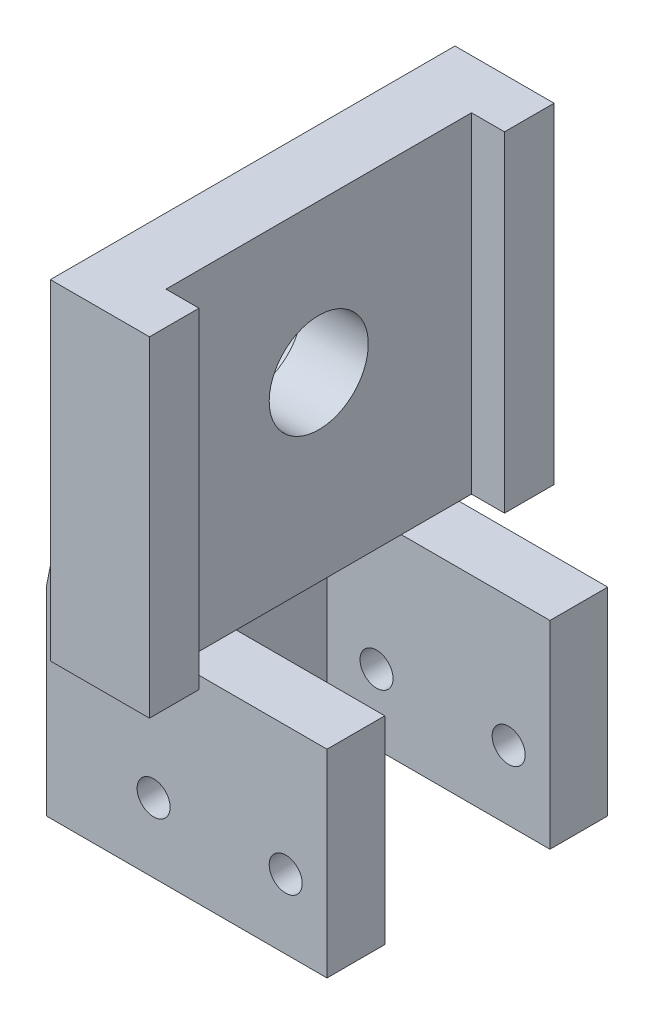
ISO-10303-21;
HEADER;
FILE_DESCRIPTION(('STEP AP214'),'2;1');
FILE_NAME('part.step','',(''),(''),'','','');
FILE_SCHEMA(('AUTOMOTIVE_DESIGN { 1 0 10303 214 1 1 1 1 }'));
ENDSEC;
DATA;
#1=APPLICATION_CONTEXT('core data for automotive mechanical design processes');
#2=APPLICATION_PROTOCOL_DEFINITION('international standard','automotive_design',2000,#1);
#3=PRODUCT_CONTEXT('',#1,'mechanical');
#4=PRODUCT('Part','Part','',(#3));
#5=PRODUCT_RELATED_PRODUCT_CATEGORY('part','',(#4));
#6=PRODUCT_DEFINITION_FORMATION('','',#4);
#7=PRODUCT_DEFINITION_CONTEXT('part definition',#1,'design');
#8=PRODUCT_DEFINITION('design','',#6,#7);
#9=PRODUCT_DEFINITION_SHAPE('','',#8);
#10=(LENGTH_UNIT() NAMED_UNIT(*) SI_UNIT(.MILLI.,.METRE.));
#11=(NAMED_UNIT(*) PLANE_ANGLE_UNIT() SI_UNIT($,.RADIAN.));
#12=(NAMED_UNIT(*) SI_UNIT($,.STERADIAN.) SOLID_ANGLE_UNIT());
#13=UNCERTAINTY_MEASURE_WITH_UNIT(LENGTH_MEASURE(1.E-05),#10,'distance_accuracy_value','');
#14=(GEOMETRIC_REPRESENTATION_CONTEXT(3) GLOBAL_UNCERTAINTY_ASSIGNED_CONTEXT((#13)) GLOBAL_UNIT_ASSIGNED_CONTEXT((#10,
#11,#12)) REPRESENTATION_CONTEXT('',''));
#15=CARTESIAN_POINT('',(0.,0.,0.));
#16=DIRECTION('',(0.,0.,1.));
#17=DIRECTION('',(1.,0.,0.));
#18=AXIS2_PLACEMENT_3D('',#15,#16,#17);
#19=CARTESIAN_POINT('',(-16.5196941383112,-12.,0.0898514208462865));
#20=DIRECTION('',(0.,0.,-1.));
#21=DIRECTION('',(-1.,0.,0.));
#22=AXIS2_PLACEMENT_3D('',#19,#20,#21);
#23=PLANE('',#22);
#24=CARTESIAN_POINT('',(-27.0196941383112,-7.8,0.0898514208462851));
#25=DIRECTION('',(0.,0.,-1.));
#26=DIRECTION('',(-1.,0.,0.));
#27=AXIS2_PLACEMENT_3D('',#24,#25,#26);
#28=CIRCLE('',#27,1.);
#29=CARTESIAN_POINT('',(-28.0196941383112,-7.8,0.0898514208462849));
#30=VERTEX_POINT('',#29);
#31=EDGE_CURVE('E234',#30,#30,#28,.T.);
#32=ORIENTED_EDGE('',*,*,#31,.T.);
#33=EDGE_LOOP('',(#32));
#34=FACE_BOUND('',#33,.T.);
#35=CARTESIAN_POINT('',(-19.0196941383112,-7.8,0.0898514208462868));
#36=DIRECTION('',(0.,0.,-1.));
#37=DIRECTION('',(-1.,0.,0.));
#38=AXIS2_PLACEMENT_3D('',#35,#36,#37);
#39=CIRCLE('',#38,1.);
#40=CARTESIAN_POINT('',(-20.0196941383112,-7.8,0.0898514208462867));
#41=VERTEX_POINT('',#40);
#42=EDGE_CURVE('E240',#41,#41,#39,.T.);
#43=ORIENTED_EDGE('',*,*,#42,.T.);
#44=EDGE_LOOP('',(#43));
#45=FACE_BOUND('',#44,.T.);
#46=DIRECTION('',(-0.776863811983067,-0.629668657018227,0.));
#47=VECTOR('',#46,1.);
#48=CARTESIAN_POINT('',(-25.5196941383112,0.,0.0898514208462781));
#49=LINE('',#48,#47);
#50=CARTESIAN_POINT('',(-25.5196941383112,0.,0.0898514208462851));
#51=VERTEX_POINT('',#50);
#52=CARTESIAN_POINT('',(-30.0196941383112,-3.64736896335671,0.0898514208462848));
#53=VERTEX_POINT('',#52);
#54=EDGE_CURVE('E55',#51,#53,#49,.T.);
#55=ORIENTED_EDGE('',*,*,#54,.T.);
#56=DIRECTION('',(0.,1.,0.));
#57=VECTOR('',#56,1.);
#58=CARTESIAN_POINT('',(-30.0196941383112,-12.,0.0898514208462848));
#59=LINE('',#58,#57);
#60=CARTESIAN_POINT('',(-30.0196941383112,-12.,0.0898514208462848));
#61=VERTEX_POINT('',#60);
#62=EDGE_CURVE('E190',#61,#53,#59,.T.);
#63=ORIENTED_EDGE('',*,*,#62,.F.);
#64=DIRECTION('',(-1.,0.,0.));
#65=VECTOR('',#64,1.);
#66=CARTESIAN_POINT('',(-16.5196941383112,-12.,0.0898514208462865));
#67=LINE('',#66,#65);
#68=CARTESIAN_POINT('',(-16.5196941383112,-12.,0.0898514208462865));
#69=VERTEX_POINT('',#68);
#70=EDGE_CURVE('E247',#69,#61,#67,.T.);
#71=ORIENTED_EDGE('',*,*,#70,.F.);
#72=DIRECTION('',(0.,1.,0.));
#73=VECTOR('',#72,1.);
#74=CARTESIAN_POINT('',(-16.5196941383112,-12.,0.0898514208462865));
#75=LINE('',#74,#73);
#76=CARTESIAN_POINT('',(-16.5196941383112,0.,0.0898514208462865));
#77=VERTEX_POINT('',#76);
#78=EDGE_CURVE('E289',#69,#77,#75,.T.);
#79=ORIENTED_EDGE('',*,*,#78,.T.);
#80=DIRECTION('',(-1.,0.,0.));
#81=VECTOR('',#80,1.);
#82=CARTESIAN_POINT('',(-16.5196941383112,0.,0.0898514208462865));
#83=LINE('',#82,#81);
#84=EDGE_CURVE('E263',#77,#51,#83,.T.);
#85=ORIENTED_EDGE('',*,*,#84,.T.);
#86=EDGE_LOOP('',(#55,#63,#71,#79,#85));
#87=FACE_BOUND('',#86,.T.);
#88=ADVANCED_FACE('F37',(#34,#45,#87),#23,.F.);
#89=CARTESIAN_POINT('',(-30.0196941383112,-12.,0.0898514208462848));
#90=DIRECTION('',(-1.,0.,0.));
#91=DIRECTION('',(0.,0.,1.));
#92=AXIS2_PLACEMENT_3D('',#89,#90,#91);
#93=PLANE('',#92);
#94=DIRECTION('',(0.,0.,1.));
#95=VECTOR('',#94,1.);
#96=CARTESIAN_POINT('',(-30.0196941383112,-3.64736896335671,0.0898514208462781));
#97=LINE('',#96,#95);
#98=CARTESIAN_POINT('',(-30.0196941383112,-3.64736896335671,10.0898514208463));
#99=VERTEX_POINT('',#98);
#100=EDGE_CURVE('E194',#53,#99,#97,.T.);
#101=ORIENTED_EDGE('',*,*,#100,.T.);
#102=DIRECTION('',(0.,1.,0.));
#103=VECTOR('',#102,1.);
#104=CARTESIAN_POINT('',(-30.0196941383112,-12.,10.0898514208463));
#105=LINE('',#104,#103);
#106=CARTESIAN_POINT('',(-30.0196941383112,-12.,10.0898514208463));
#107=VERTEX_POINT('',#106);
#108=EDGE_CURVE('E180',#107,#99,#105,.T.);
#109=ORIENTED_EDGE('',*,*,#108,.F.);
#110=DIRECTION('',(0.,0.,1.));
#111=VECTOR('',#110,1.);
#112=CARTESIAN_POINT('',(-30.0196941383112,-12.,0.0898514208462848));
#113=LINE('',#112,#111);
#114=EDGE_CURVE('E249',#61,#107,#113,.T.);
#115=ORIENTED_EDGE('',*,*,#114,.F.);
#116=ORIENTED_EDGE('',*,*,#62,.T.);
#117=EDGE_LOOP('',(#101,#109,#115,#116));
#118=FACE_BOUND('',#117,.T.);
#119=ADVANCED_FACE('F195',(#118),#93,.F.);
#120=CARTESIAN_POINT('',(-30.0196941383112,-12.,10.0898514208463));
#121=DIRECTION('',(0.,0.,1.));
#122=DIRECTION('',(1.,0.,0.));
#123=AXIS2_PLACEMENT_3D('',#120,#121,#122);
#124=PLANE('',#123);
#125=CARTESIAN_POINT('',(-27.0196941383112,-7.8,10.0898514208463));
#126=DIRECTION('',(0.,0.,1.));
#127=DIRECTION('',(1.,0.,0.));
#128=AXIS2_PLACEMENT_3D('',#125,#126,#127);
#129=CIRCLE('',#128,1.);
#130=CARTESIAN_POINT('',(-26.0196941383112,-7.8,10.0898514208463));
#131=VERTEX_POINT('',#130);
#132=EDGE_CURVE('E223',#131,#131,#129,.T.);
#133=ORIENTED_EDGE('',*,*,#132,.T.);
#134=EDGE_LOOP('',(#133));
#135=FACE_BOUND('',#134,.T.);
#136=CARTESIAN_POINT('',(-19.0196941383112,-7.8,10.0898514208463));
#137=DIRECTION('',(0.,0.,1.));
#138=DIRECTION('',(1.,0.,0.));
#139=AXIS2_PLACEMENT_3D('',#136,#137,#138);
#140=CIRCLE('',#139,1.);
#141=CARTESIAN_POINT('',(-18.0196941383112,-7.8,10.0898514208463));
#142=VERTEX_POINT('',#141);
#143=EDGE_CURVE('E237',#142,#142,#140,.T.);
#144=ORIENTED_EDGE('',*,*,#143,.T.);
#145=EDGE_LOOP('',(#144));
#146=FACE_BOUND('',#145,.T.);
#147=DIRECTION('',(-0.776863811983067,-0.629668657018227,0.));
#148=VECTOR('',#147,1.);
#149=CARTESIAN_POINT('',(-25.5196941383112,0.,10.0898514208463));
#150=LINE('',#149,#148);
#151=CARTESIAN_POINT('',(-25.5196941383112,0.,10.0898514208463));
#152=VERTEX_POINT('',#151);
#153=EDGE_CURVE('E184',#152,#99,#150,.T.);
#154=ORIENTED_EDGE('',*,*,#153,.F.);
#155=DIRECTION('',(1.,0.,0.));
#156=VECTOR('',#155,1.);
#157=CARTESIAN_POINT('',(-30.0196941383112,0.,10.0898514208463));
#158=LINE('',#157,#156);
#159=CARTESIAN_POINT('',(-16.5196941383112,0.,10.0898514208463));
#160=VERTEX_POINT('',#159);
#161=EDGE_CURVE('E265',#152,#160,#158,.T.);
#162=ORIENTED_EDGE('',*,*,#161,.T.);
#163=DIRECTION('',(0.,1.,0.));
#164=VECTOR('',#163,1.);
#165=CARTESIAN_POINT('',(-16.5196941383112,-12.,10.0898514208463));
#166=LINE('',#165,#164);
#167=CARTESIAN_POINT('',(-16.5196941383112,-12.,10.0898514208463));
#168=VERTEX_POINT('',#167);
#169=EDGE_CURVE('E191',#168,#160,#166,.T.);
#170=ORIENTED_EDGE('',*,*,#169,.F.);
#171=DIRECTION('',(1.,0.,0.));
#172=VECTOR('',#171,1.);
#173=CARTESIAN_POINT('',(-30.0196941383112,-12.,10.0898514208463));
#174=LINE('',#173,#172);
#175=EDGE_CURVE('E187',#107,#168,#174,.T.);
#176=ORIENTED_EDGE('',*,*,#175,.F.);
#177=ORIENTED_EDGE('',*,*,#108,.T.);
#178=EDGE_LOOP('',(#154,#162,#170,#176,#177));
#179=FACE_BOUND('',#178,.T.);
#180=ADVANCED_FACE('F182',(#135,#146,#179),#124,.F.);
#181=CARTESIAN_POINT('',(0.,0.,0.));
#182=DIRECTION('',(0.,1.,0.));
#183=DIRECTION('',(0.,0.,1.));
#184=AXIS2_PLACEMENT_3D('',#181,#182,#183);
#185=PLANE('',#184);
#186=DIRECTION('',(1.,0.,0.));
#187=VECTOR('',#186,1.);
#188=CARTESIAN_POINT('',(-16.5196941383112,0.,-3.41014857915371));
#189=LINE('',#188,#187);
#190=CARTESIAN_POINT('',(-29.5196941383112,0.,-3.41014857915372));
#191=VERTEX_POINT('',#190);
#192=CARTESIAN_POINT('',(-25.5196941383112,0.,-3.41014857915372));
#193=VERTEX_POINT('',#192);
#194=EDGE_CURVE('E11',#191,#193,#189,.T.);
#195=ORIENTED_EDGE('',*,*,#194,.F.);
#196=DIRECTION('',(0.,0.,1.));
#197=VECTOR('',#196,1.);
#198=CARTESIAN_POINT('',(-29.5196941383112,0.,-7.16014857915371));
#199=LINE('',#198,#197);
#200=CARTESIAN_POINT('',(-29.5196941383112,0.,-7.16014857915371));
#201=VERTEX_POINT('',#200);
#202=EDGE_CURVE('E318',#201,#191,#199,.T.);
#203=ORIENTED_EDGE('',*,*,#202,.F.);
#204=DIRECTION('',(-1.,0.,0.));
#205=VECTOR('',#204,1.);
#206=CARTESIAN_POINT('',(-23.5196941383112,0.,-7.16014857915371));
#207=LINE('',#206,#205);
#208=CARTESIAN_POINT('',(-23.5196941383112,0.,-7.16014857915371));
#209=VERTEX_POINT('',#208);
#210=EDGE_CURVE('E295',#209,#201,#207,.T.);
#211=ORIENTED_EDGE('',*,*,#210,.F.);
#212=DIRECTION('',(0.,0.,-1.));
#213=VECTOR('',#212,1.);
#214=CARTESIAN_POINT('',(-23.5196941383112,0.,-4.16014857915371));
#215=LINE('',#214,#213);
#216=CARTESIAN_POINT('',(-23.5196941383112,0.,-4.16014857915371));
#217=VERTEX_POINT('',#216);
#218=EDGE_CURVE('E300',#217,#209,#215,.T.);
#219=ORIENTED_EDGE('',*,*,#218,.F.);
#220=DIRECTION('',(1.,0.,0.));
#221=VECTOR('',#220,1.);
#222=CARTESIAN_POINT('',(-25.5196941383112,0.,-4.16014857915371));
#223=LINE('',#222,#221);
#224=CARTESIAN_POINT('',(-25.5196941383112,0.,-4.16014857915371));
#225=VERTEX_POINT('',#224);
#226=EDGE_CURVE('E331',#225,#217,#223,.T.);
#227=ORIENTED_EDGE('',*,*,#226,.F.);
#228=DIRECTION('',(0.,0.,-1.));
#229=VECTOR('',#228,1.);
#230=CARTESIAN_POINT('',(-25.5196941383112,0.,14.3398514208463));
#231=LINE('',#230,#229);
#232=EDGE_CURVE('E327',#193,#225,#231,.T.);
#233=ORIENTED_EDGE('',*,*,#232,.F.);
#234=EDGE_LOOP('',(#195,#203,#211,#219,#227,#233));
#235=FACE_BOUND('',#234,.T.);
#236=ADVANCED_FACE('F392',(#235),#185,.F.);
#237=DIRECTION('',(-1.,0.,0.));
#238=VECTOR('',#237,1.);
#239=CARTESIAN_POINT('',(-16.5196941383112,0.,13.5898514208463));
#240=LINE('',#239,#238);
#241=CARTESIAN_POINT('',(-25.5196941383112,0.,13.5898514208463));
#242=VERTEX_POINT('',#241);
#243=CARTESIAN_POINT('',(-29.5196941383112,0.,13.5898514208463));
#244=VERTEX_POINT('',#243);
#245=EDGE_CURVE('E46',#242,#244,#240,.T.);
#246=ORIENTED_EDGE('',*,*,#245,.F.);
#247=CARTESIAN_POINT('',(-25.5196941383112,0.,14.3398514208463));
#248=VERTEX_POINT('',#247);
#249=EDGE_CURVE('E328',#248,#242,#231,.T.);
#250=ORIENTED_EDGE('',*,*,#249,.F.);
#251=DIRECTION('',(-1.,0.,0.));
#252=VECTOR('',#251,1.);
#253=CARTESIAN_POINT('',(-23.5196941383112,0.,14.3398514208463));
#254=LINE('',#253,#252);
#255=CARTESIAN_POINT('',(-23.5196941383112,0.,14.3398514208463));
#256=VERTEX_POINT('',#255);
#257=EDGE_CURVE('E325',#256,#248,#254,.T.);
#258=ORIENTED_EDGE('',*,*,#257,.F.);
#259=DIRECTION('',(0.,0.,-1.));
#260=VECTOR('',#259,1.);
#261=CARTESIAN_POINT('',(-23.5196941383112,0.,17.3398514208463));
#262=LINE('',#261,#260);
#263=CARTESIAN_POINT('',(-23.5196941383112,0.,17.3398514208463));
#264=VERTEX_POINT('',#263);
#265=EDGE_CURVE('E323',#264,#256,#262,.T.);
#266=ORIENTED_EDGE('',*,*,#265,.F.);
#267=DIRECTION('',(1.,0.,0.));
#268=VECTOR('',#267,1.);
#269=CARTESIAN_POINT('',(-29.5196941383112,0.,17.3398514208463));
#270=LINE('',#269,#268);
#271=CARTESIAN_POINT('',(-29.5196941383112,0.,17.3398514208463));
#272=VERTEX_POINT('',#271);
#273=EDGE_CURVE('E321',#272,#264,#270,.T.);
#274=ORIENTED_EDGE('',*,*,#273,.F.);
#275=EDGE_CURVE('E317',#244,#272,#199,.T.);
#276=ORIENTED_EDGE('',*,*,#275,.F.);
#277=EDGE_LOOP('',(#246,#250,#258,#266,#274,#276));
#278=FACE_BOUND('',#277,.T.);
#279=ADVANCED_FACE('F368',(#278),#185,.F.);
#280=CARTESIAN_POINT('',(-23.5196941383112,20.,-7.16014857915371));
#281=DIRECTION('',(0.,0.,1.));
#282=DIRECTION('',(1.,0.,0.));
#283=AXIS2_PLACEMENT_3D('',#280,#281,#282);
#284=PLANE('',#283);
#285=ORIENTED_EDGE('',*,*,#210,.T.);
#286=DIRECTION('',(0.,-1.,0.));
#287=VECTOR('',#286,1.);
#288=CARTESIAN_POINT('',(-29.5196941383112,20.,-7.16014857915371));
#289=LINE('',#288,#287);
#290=CARTESIAN_POINT('',(-29.5196941383112,20.,-7.16014857915371));
#291=VERTEX_POINT('',#290);
#292=EDGE_CURVE('E354',#291,#201,#289,.T.);
#293=ORIENTED_EDGE('',*,*,#292,.F.);
#294=DIRECTION('',(-1.,0.,0.));
#295=VECTOR('',#294,1.);
#296=CARTESIAN_POINT('',(-23.5196941383112,20.,-7.16014857915371));
#297=LINE('',#296,#295);
#298=CARTESIAN_POINT('',(-23.5196941383112,20.,-7.16014857915371));
#299=VERTEX_POINT('',#298);
#300=EDGE_CURVE('E296',#299,#291,#297,.T.);
#301=ORIENTED_EDGE('',*,*,#300,.F.);
#302=DIRECTION('',(0.,-1.,0.));
#303=VECTOR('',#302,1.);
#304=CARTESIAN_POINT('',(-23.5196941383112,20.,-7.16014857915371));
#305=LINE('',#304,#303);
#306=EDGE_CURVE('E314',#299,#209,#305,.T.);
#307=ORIENTED_EDGE('',*,*,#306,.T.);
#308=EDGE_LOOP('',(#285,#293,#301,#307));
#309=FACE_BOUND('',#308,.T.);
#310=ADVANCED_FACE('F39',(#309),#284,.F.);
#311=CARTESIAN_POINT('',(-29.5196941383112,20.,-7.16014857915371));
#312=DIRECTION('',(1.,0.,0.));
#313=DIRECTION('',(0.,0.,-1.));
#314=AXIS2_PLACEMENT_3D('',#311,#312,#313);
#315=PLANE('',#314);
#316=DIRECTION('',(0.,0.,-1.));
#317=VECTOR('',#316,1.);
#318=CARTESIAN_POINT('',(-29.5196941383112,19.9572029758386,13.5898514208463));
#319=LINE('',#318,#317);
#320=CARTESIAN_POINT('',(-29.5196941383112,19.9572029758386,13.5898514208463));
#321=VERTEX_POINT('',#320);
#322=CARTESIAN_POINT('',(-29.5196941383112,19.9572029758386,-3.41014857915372));
#323=VERTEX_POINT('',#322);
#324=EDGE_CURVE('E211',#321,#323,#319,.T.);
#325=ORIENTED_EDGE('',*,*,#324,.F.);
#326=DIRECTION('',(0.,-1.,0.));
#327=VECTOR('',#326,1.);
#328=CARTESIAN_POINT('',(-29.5196941383112,19.9572029758386,13.5898514208463));
#329=LINE('',#328,#327);
#330=EDGE_CURVE('E209',#321,#244,#329,.T.);
#331=ORIENTED_EDGE('',*,*,#330,.T.);
#332=ORIENTED_EDGE('',*,*,#275,.T.);
#333=DIRECTION('',(0.,-1.,0.));
#334=VECTOR('',#333,1.);
#335=CARTESIAN_POINT('',(-29.5196941383112,20.,17.3398514208463));
#336=LINE('',#335,#334);
#337=CARTESIAN_POINT('',(-29.5196941383112,20.,17.3398514208463));
#338=VERTEX_POINT('',#337);
#339=EDGE_CURVE('E352',#338,#272,#336,.T.);
#340=ORIENTED_EDGE('',*,*,#339,.F.);
#341=DIRECTION('',(0.,0.,1.));
#342=VECTOR('',#341,1.);
#343=CARTESIAN_POINT('',(-29.5196941383112,20.,-7.16014857915371));
#344=LINE('',#343,#342);
#345=EDGE_CURVE('E299',#291,#338,#344,.T.);
#346=ORIENTED_EDGE('',*,*,#345,.F.);
#347=ORIENTED_EDGE('',*,*,#292,.T.);
#348=ORIENTED_EDGE('',*,*,#202,.T.);
#349=DIRECTION('',(0.,-1.,0.));
#350=VECTOR('',#349,1.);
#351=CARTESIAN_POINT('',(-29.5196941383112,19.9572029758386,-3.41014857915372));
#352=LINE('',#351,#350);
#353=EDGE_CURVE('E62',#323,#191,#352,.T.);
#354=ORIENTED_EDGE('',*,*,#353,.F.);
#355=EDGE_LOOP('',(#325,#331,#332,#340,#346,#347,#348,#354));
#356=FACE_BOUND('',#355,.T.);
#357=ADVANCED_FACE('F415',(#356),#315,.F.);
#358=CARTESIAN_POINT('',(-29.5196941383112,20.,17.3398514208463));
#359=DIRECTION('',(0.,0.,-1.));
#360=DIRECTION('',(-1.,0.,0.));
#361=AXIS2_PLACEMENT_3D('',#358,#359,#360);
#362=PLANE('',#361);
#363=ORIENTED_EDGE('',*,*,#273,.T.);
#364=DIRECTION('',(0.,-1.,0.));
#365=VECTOR('',#364,1.);
#366=CARTESIAN_POINT('',(-23.5196941383112,20.,17.3398514208463));
#367=LINE('',#366,#365);
#368=CARTESIAN_POINT('',(-23.5196941383112,20.,17.3398514208463));
#369=VERTEX_POINT('',#368);
#370=EDGE_CURVE('E349',#369,#264,#367,.T.);
#371=ORIENTED_EDGE('',*,*,#370,.F.);
#372=DIRECTION('',(1.,0.,0.));
#373=VECTOR('',#372,1.);
#374=CARTESIAN_POINT('',(-29.5196941383112,20.,17.3398514208463));
#375=LINE('',#374,#373);
#376=EDGE_CURVE('E302',#338,#369,#375,.T.);
#377=ORIENTED_EDGE('',*,*,#376,.F.);
#378=ORIENTED_EDGE('',*,*,#339,.T.);
#379=EDGE_LOOP('',(#363,#371,#377,#378));
#380=FACE_BOUND('',#379,.T.);
#381=ADVANCED_FACE('F414',(#380),#362,.F.);
#382=CARTESIAN_POINT('',(-23.5196941383112,20.,17.3398514208463));
#383=DIRECTION('',(-1.,0.,0.));
#384=DIRECTION('',(0.,0.,1.));
#385=AXIS2_PLACEMENT_3D('',#382,#383,#384);
#386=PLANE('',#385);
#387=ORIENTED_EDGE('',*,*,#265,.T.);
#388=DIRECTION('',(0.,-1.,0.));
#389=VECTOR('',#388,1.);
#390=CARTESIAN_POINT('',(-23.5196941383112,20.,14.3398514208463));
#391=LINE('',#390,#389);
#392=CARTESIAN_POINT('',(-23.5196941383112,20.,14.3398514208463));
#393=VERTEX_POINT('',#392);
#394=EDGE_CURVE('E346',#393,#256,#391,.T.);
#395=ORIENTED_EDGE('',*,*,#394,.F.);
#396=DIRECTION('',(0.,0.,-1.));
#397=VECTOR('',#396,1.);
#398=CARTESIAN_POINT('',(-23.5196941383112,20.,17.3398514208463));
#399=LINE('',#398,#397);
#400=EDGE_CURVE('E304',#369,#393,#399,.T.);
#401=ORIENTED_EDGE('',*,*,#400,.F.);
#402=ORIENTED_EDGE('',*,*,#370,.T.);
#403=EDGE_LOOP('',(#387,#395,#401,#402));
#404=FACE_BOUND('',#403,.T.);
#405=ADVANCED_FACE('F410',(#404),#386,.F.);
#406=CARTESIAN_POINT('',(-23.5196941383112,20.,14.3398514208463));
#407=DIRECTION('',(0.,0.,1.));
#408=DIRECTION('',(1.,0.,0.));
#409=AXIS2_PLACEMENT_3D('',#406,#407,#408);
#410=PLANE('',#409);
#411=ORIENTED_EDGE('',*,*,#257,.T.);
#412=DIRECTION('',(0.,-1.,0.));
#413=VECTOR('',#412,1.);
#414=CARTESIAN_POINT('',(-25.5196941383112,20.,14.3398514208463));
#415=LINE('',#414,#413);
#416=CARTESIAN_POINT('',(-25.5196941383112,20.,14.3398514208463));
#417=VERTEX_POINT('',#416);
#418=EDGE_CURVE('E343',#417,#248,#415,.T.);
#419=ORIENTED_EDGE('',*,*,#418,.F.);
#420=DIRECTION('',(-1.,0.,0.));
#421=VECTOR('',#420,1.);
#422=CARTESIAN_POINT('',(-23.5196941383112,20.,14.3398514208463));
#423=LINE('',#422,#421);
#424=EDGE_CURVE('E306',#393,#417,#423,.T.);
#425=ORIENTED_EDGE('',*,*,#424,.F.);
#426=ORIENTED_EDGE('',*,*,#394,.T.);
#427=EDGE_LOOP('',(#411,#419,#425,#426));
#428=FACE_BOUND('',#427,.T.);
#429=ADVANCED_FACE('F407',(#428),#410,.F.);
#430=CARTESIAN_POINT('',(-25.5196941383112,20.,14.3398514208463));
#431=DIRECTION('',(-1.,0.,0.));
#432=DIRECTION('',(0.,0.,1.));
#433=AXIS2_PLACEMENT_3D('',#430,#431,#432);
#434=PLANE('',#433);
#435=CARTESIAN_POINT('',(-25.5196941383112,11.,5.08985142084629));
#436=DIRECTION('',(-1.,0.,0.));
#437=DIRECTION('',(0.,0.,1.));
#438=AXIS2_PLACEMENT_3D('',#435,#436,#437);
#439=CIRCLE('',#438,3.);
#440=CARTESIAN_POINT('',(-25.5196941383112,11.,8.08985142084629));
#441=VERTEX_POINT('',#440);
#442=EDGE_CURVE('E292',#441,#441,#439,.T.);
#443=ORIENTED_EDGE('',*,*,#442,.T.);
#444=EDGE_LOOP('',(#443));
#445=FACE_BOUND('',#444,.T.);
#446=ORIENTED_EDGE('',*,*,#249,.T.);
#447=EDGE_CURVE('E332',#242,#152,#231,.T.);
#448=ORIENTED_EDGE('',*,*,#447,.T.);
#449=EDGE_CURVE('E201',#152,#51,#231,.T.);
#450=ORIENTED_EDGE('',*,*,#449,.T.);
#451=EDGE_CURVE('E380',#51,#193,#231,.T.);
#452=ORIENTED_EDGE('',*,*,#451,.T.);
#453=ORIENTED_EDGE('',*,*,#232,.T.);
#454=DIRECTION('',(0.,-1.,0.));
#455=VECTOR('',#454,1.);
#456=CARTESIAN_POINT('',(-25.5196941383112,20.,-4.16014857915371));
#457=LINE('',#456,#455);
#458=CARTESIAN_POINT('',(-25.5196941383112,20.,-4.16014857915371));
#459=VERTEX_POINT('',#458);
#460=EDGE_CURVE('E340',#459,#225,#457,.T.);
#461=ORIENTED_EDGE('',*,*,#460,.F.);
#462=DIRECTION('',(0.,0.,-1.));
#463=VECTOR('',#462,1.);
#464=CARTESIAN_POINT('',(-25.5196941383112,20.,14.3398514208463));
#465=LINE('',#464,#463);
#466=EDGE_CURVE('E308',#417,#459,#465,.T.);
#467=ORIENTED_EDGE('',*,*,#466,.F.);
#468=ORIENTED_EDGE('',*,*,#418,.T.);
#469=EDGE_LOOP('',(#446,#448,#450,#452,#453,#461,#467,#468));
#470=FACE_BOUND('',#469,.T.);
#471=ADVANCED_FACE('F373',(#445,#470),#434,.F.);
#472=CARTESIAN_POINT('',(-25.5196941383112,20.,-4.16014857915371));
#473=DIRECTION('',(0.,0.,-1.));
#474=DIRECTION('',(-1.,0.,0.));
#475=AXIS2_PLACEMENT_3D('',#472,#473,#474);
#476=PLANE('',#475);
#477=ORIENTED_EDGE('',*,*,#226,.T.);
#478=DIRECTION('',(0.,-1.,0.));
#479=VECTOR('',#478,1.);
#480=CARTESIAN_POINT('',(-23.5196941383112,20.,-4.16014857915371));
#481=LINE('',#480,#479);
#482=CARTESIAN_POINT('',(-23.5196941383112,20.,-4.16014857915371));
#483=VERTEX_POINT('',#482);
#484=EDGE_CURVE('E337',#483,#217,#481,.T.);
#485=ORIENTED_EDGE('',*,*,#484,.F.);
#486=DIRECTION('',(1.,0.,0.));
#487=VECTOR('',#486,1.);
#488=CARTESIAN_POINT('',(-25.5196941383112,20.,-4.16014857915371));
#489=LINE('',#488,#487);
#490=EDGE_CURVE('E310',#459,#483,#489,.T.);
#491=ORIENTED_EDGE('',*,*,#490,.F.);
#492=ORIENTED_EDGE('',*,*,#460,.T.);
#493=EDGE_LOOP('',(#477,#485,#491,#492));
#494=FACE_BOUND('',#493,.T.);
#495=ADVANCED_FACE('F389',(#494),#476,.F.);
#496=CARTESIAN_POINT('',(-23.5196941383112,20.,-4.16014857915371));
#497=DIRECTION('',(-1.,0.,0.));
#498=DIRECTION('',(0.,0.,1.));
#499=AXIS2_PLACEMENT_3D('',#496,#497,#498);
#500=PLANE('',#499);
#501=ORIENTED_EDGE('',*,*,#218,.T.);
#502=ORIENTED_EDGE('',*,*,#306,.F.);
#503=DIRECTION('',(0.,0.,-1.));
#504=VECTOR('',#503,1.);
#505=CARTESIAN_POINT('',(-23.5196941383112,20.,-4.16014857915371));
#506=LINE('',#505,#504);
#507=EDGE_CURVE('E312',#483,#299,#506,.T.);
#508=ORIENTED_EDGE('',*,*,#507,.F.);
#509=ORIENTED_EDGE('',*,*,#484,.T.);
#510=EDGE_LOOP('',(#501,#502,#508,#509));
#511=FACE_BOUND('',#510,.T.);
#512=ADVANCED_FACE('F396',(#511),#500,.F.);
#513=CARTESIAN_POINT('',(0.,20.,0.));
#514=DIRECTION('',(0.,1.,0.));
#515=DIRECTION('',(0.,0.,1.));
#516=AXIS2_PLACEMENT_3D('',#513,#514,#515);
#517=PLANE('',#516);
#518=ORIENTED_EDGE('',*,*,#300,.T.);
#519=ORIENTED_EDGE('',*,*,#345,.T.);
#520=ORIENTED_EDGE('',*,*,#376,.T.);
#521=ORIENTED_EDGE('',*,*,#400,.T.);
#522=ORIENTED_EDGE('',*,*,#424,.T.);
#523=ORIENTED_EDGE('',*,*,#466,.T.);
#524=ORIENTED_EDGE('',*,*,#490,.T.);
#525=ORIENTED_EDGE('',*,*,#507,.T.);
#526=EDGE_LOOP('',(#518,#519,#520,#521,#522,#523,#524,#525));
#527=FACE_BOUND('',#526,.T.);
#528=ADVANCED_FACE('F401',(#527),#517,.T.);
#529=CARTESIAN_POINT('',(-25.5196941383112,11.,5.08985142084629));
#530=DIRECTION('',(-1.,0.,0.));
#531=DIRECTION('',(0.,0.,1.));
#532=AXIS2_PLACEMENT_3D('',#529,#530,#531);
#533=CYLINDRICAL_SURFACE('',#532,3.);
#534=ORIENTED_EDGE('',*,*,#442,.F.);
#535=EDGE_LOOP('',(#534));
#536=FACE_BOUND('',#535,.T.);
#537=CARTESIAN_POINT('',(-29.5196941383112,11.,5.08985142084629));
#538=DIRECTION('',(1.,0.,0.));
#539=DIRECTION('',(0.,1.,0.));
#540=AXIS2_PLACEMENT_3D('',#537,#538,#539);
#541=CIRCLE('',#540,3.);
#542=CARTESIAN_POINT('',(-29.5196941383112,14.,5.08985142084629));
#543=VERTEX_POINT('',#542);
#544=EDGE_CURVE('E214',#543,#543,#541,.F.);
#545=ORIENTED_EDGE('',*,*,#544,.T.);
#546=EDGE_LOOP('',(#545));
#547=FACE_BOUND('',#546,.T.);
#548=ADVANCED_FACE('F454',(#536,#547),#533,.F.);
#549=CARTESIAN_POINT('',(0.,0.,0.));
#550=DIRECTION('',(0.,-1.,0.));
#551=DIRECTION('',(0.,0.,-1.));
#552=AXIS2_PLACEMENT_3D('',#549,#550,#551);
#553=PLANE('',#552);
#554=ORIENTED_EDGE('',*,*,#451,.F.);
#555=ORIENTED_EDGE('',*,*,#84,.F.);
#556=DIRECTION('',(0.,0.,1.));
#557=VECTOR('',#556,1.);
#558=CARTESIAN_POINT('',(-16.5196941383112,0.,-3.41014857915371));
#559=LINE('',#558,#557);
#560=CARTESIAN_POINT('',(-16.5196941383112,0.,-3.41014857915371));
#561=VERTEX_POINT('',#560);
#562=EDGE_CURVE('E243',#561,#77,#559,.T.);
#563=ORIENTED_EDGE('',*,*,#562,.F.);
#564=EDGE_CURVE('E48',#193,#561,#189,.T.);
#565=ORIENTED_EDGE('',*,*,#564,.F.);
#566=EDGE_LOOP('',(#554,#555,#563,#565));
#567=FACE_BOUND('',#566,.T.);
#568=ADVANCED_FACE('F457',(#567),#553,.F.);
#569=ORIENTED_EDGE('',*,*,#447,.F.);
#570=CARTESIAN_POINT('',(-16.5196941383112,0.,13.5898514208463));
#571=VERTEX_POINT('',#570);
#572=EDGE_CURVE('E269',#571,#242,#240,.T.);
#573=ORIENTED_EDGE('',*,*,#572,.F.);
#574=DIRECTION('',(0.,0.,1.));
#575=VECTOR('',#574,1.);
#576=CARTESIAN_POINT('',(-16.5196941383112,0.,10.0898514208463));
#577=LINE('',#576,#575);
#578=EDGE_CURVE('E267',#160,#571,#577,.T.);
#579=ORIENTED_EDGE('',*,*,#578,.F.);
#580=ORIENTED_EDGE('',*,*,#161,.F.);
#581=EDGE_LOOP('',(#569,#573,#579,#580));
#582=FACE_BOUND('',#581,.T.);
#583=ADVANCED_FACE('F378',(#582),#553,.F.);
#584=CARTESIAN_POINT('',(-16.5196941383112,-12.,-3.41014857915371));
#585=DIRECTION('',(-1.,0.,0.));
#586=DIRECTION('',(0.,0.,1.));
#587=AXIS2_PLACEMENT_3D('',#584,#585,#586);
#588=PLANE('',#587);
#589=ORIENTED_EDGE('',*,*,#562,.T.);
#590=ORIENTED_EDGE('',*,*,#78,.F.);
#591=DIRECTION('',(0.,0.,1.));
#592=VECTOR('',#591,1.);
#593=CARTESIAN_POINT('',(-16.5196941383112,-12.,-3.41014857915371));
#594=LINE('',#593,#592);
#595=CARTESIAN_POINT('',(-16.5196941383112,-12.,-3.41014857915371));
#596=VERTEX_POINT('',#595);
#597=EDGE_CURVE('E244',#596,#69,#594,.T.);
#598=ORIENTED_EDGE('',*,*,#597,.F.);
#599=DIRECTION('',(0.,1.,0.));
#600=VECTOR('',#599,1.);
#601=CARTESIAN_POINT('',(-16.5196941383112,-12.,-3.41014857915371));
#602=LINE('',#601,#600);
#603=EDGE_CURVE('E260',#596,#561,#602,.T.);
#604=ORIENTED_EDGE('',*,*,#603,.T.);
#605=EDGE_LOOP('',(#589,#590,#598,#604));
#606=FACE_BOUND('',#605,.T.);
#607=ADVANCED_FACE('F434',(#606),#588,.F.);
#608=CARTESIAN_POINT('',(-16.5196941383112,-12.,10.0898514208463));
#609=DIRECTION('',(-1.,0.,0.));
#610=DIRECTION('',(0.,0.,1.));
#611=AXIS2_PLACEMENT_3D('',#608,#609,#610);
#612=PLANE('',#611);
#613=ORIENTED_EDGE('',*,*,#578,.T.);
#614=DIRECTION('',(0.,1.,0.));
#615=VECTOR('',#614,1.);
#616=CARTESIAN_POINT('',(-16.5196941383112,-12.,13.5898514208463));
#617=LINE('',#616,#615);
#618=CARTESIAN_POINT('',(-16.5196941383112,-12.,13.5898514208463));
#619=VERTEX_POINT('',#618);
#620=EDGE_CURVE('E283',#619,#571,#617,.T.);
#621=ORIENTED_EDGE('',*,*,#620,.F.);
#622=DIRECTION('',(0.,0.,1.));
#623=VECTOR('',#622,1.);
#624=CARTESIAN_POINT('',(-16.5196941383112,-12.,10.0898514208463));
#625=LINE('',#624,#623);
#626=EDGE_CURVE('E252',#168,#619,#625,.T.);
#627=ORIENTED_EDGE('',*,*,#626,.F.);
#628=ORIENTED_EDGE('',*,*,#169,.T.);
#629=EDGE_LOOP('',(#613,#621,#627,#628));
#630=FACE_BOUND('',#629,.T.);
#631=ADVANCED_FACE('F432',(#630),#612,.F.);
#632=CARTESIAN_POINT('',(-16.5196941383112,-12.,13.5898514208463));
#633=DIRECTION('',(0.,0.,-1.));
#634=DIRECTION('',(-1.,0.,0.));
#635=AXIS2_PLACEMENT_3D('',#632,#633,#634);
#636=PLANE('',#635);
#637=CARTESIAN_POINT('',(-19.0196941383112,-7.8,13.5898514208463));
#638=DIRECTION('',(0.,0.,-1.));
#639=DIRECTION('',(-1.,0.,0.));
#640=AXIS2_PLACEMENT_3D('',#637,#638,#639);
#641=CIRCLE('',#640,1.);
#642=CARTESIAN_POINT('',(-20.0196941383112,-7.8,13.5898514208463));
#643=VERTEX_POINT('',#642);
#644=EDGE_CURVE('E220',#643,#643,#641,.T.);
#645=ORIENTED_EDGE('',*,*,#644,.T.);
#646=EDGE_LOOP('',(#645));
#647=FACE_BOUND('',#646,.T.);
#648=CARTESIAN_POINT('',(-27.0196941383112,-7.8,13.5898514208463));
#649=DIRECTION('',(0.,0.,-1.));
#650=DIRECTION('',(-1.,0.,0.));
#651=AXIS2_PLACEMENT_3D('',#648,#649,#650);
#652=CIRCLE('',#651,1.);
#653=CARTESIAN_POINT('',(-28.0196941383112,-7.8,13.5898514208463));
#654=VERTEX_POINT('',#653);
#655=EDGE_CURVE('E227',#654,#654,#652,.T.);
#656=ORIENTED_EDGE('',*,*,#655,.T.);
#657=EDGE_LOOP('',(#656));
#658=FACE_BOUND('',#657,.T.);
#659=ORIENTED_EDGE('',*,*,#572,.T.);
#660=ORIENTED_EDGE('',*,*,#245,.T.);
#661=ORIENTED_EDGE('',*,*,#330,.F.);
#662=DIRECTION('',(0.196520469005813,0.980499722214002,0.));
#663=VECTOR('',#662,1.);
#664=CARTESIAN_POINT('',(-33.5196941383112,0.,13.5898514208463));
#665=LINE('',#664,#663);
#666=CARTESIAN_POINT('',(-33.5196941383112,0.,13.5898514208463));
#667=VERTEX_POINT('',#666);
#668=EDGE_CURVE('E207',#667,#321,#665,.T.);
#669=ORIENTED_EDGE('',*,*,#668,.F.);
#670=DIRECTION('',(0.,1.,0.));
#671=VECTOR('',#670,1.);
#672=CARTESIAN_POINT('',(-33.5196941383112,-12.,13.5898514208463));
#673=LINE('',#672,#671);
#674=CARTESIAN_POINT('',(-33.5196941383112,-12.,13.5898514208463));
#675=VERTEX_POINT('',#674);
#676=EDGE_CURVE('E280',#675,#667,#673,.T.);
#677=ORIENTED_EDGE('',*,*,#676,.F.);
#678=DIRECTION('',(-1.,0.,0.));
#679=VECTOR('',#678,1.);
#680=CARTESIAN_POINT('',(-16.5196941383112,-12.,13.5898514208463));
#681=LINE('',#680,#679);
#682=EDGE_CURVE('E254',#619,#675,#681,.T.);
#683=ORIENTED_EDGE('',*,*,#682,.F.);
#684=ORIENTED_EDGE('',*,*,#620,.T.);
#685=EDGE_LOOP('',(#659,#660,#661,#669,#677,#683,#684));
#686=FACE_BOUND('',#685,.T.);
#687=ADVANCED_FACE('F361',(#647,#658,#686),#636,.F.);
#688=CARTESIAN_POINT('',(-33.5196941383112,-12.,-3.41014857915372));
#689=DIRECTION('',(1.,0.,0.));
#690=DIRECTION('',(0.,0.,-1.));
#691=AXIS2_PLACEMENT_3D('',#688,#689,#690);
#692=PLANE('',#691);
#693=DIRECTION('',(0.,0.,-1.));
#694=VECTOR('',#693,1.);
#695=CARTESIAN_POINT('',(-33.5196941383112,0.,-3.41014857915372));
#696=LINE('',#695,#694);
#697=CARTESIAN_POINT('',(-33.5196941383112,0.,-3.41014857915372));
#698=VERTEX_POINT('',#697);
#699=EDGE_CURVE('E272',#667,#698,#696,.T.);
#700=ORIENTED_EDGE('',*,*,#699,.T.);
#701=DIRECTION('',(0.,1.,0.));
#702=VECTOR('',#701,1.);
#703=CARTESIAN_POINT('',(-33.5196941383112,-12.,-3.41014857915372));
#704=LINE('',#703,#702);
#705=CARTESIAN_POINT('',(-33.5196941383112,-12.,-3.41014857915372));
#706=VERTEX_POINT('',#705);
#707=EDGE_CURVE('E277',#706,#698,#704,.T.);
#708=ORIENTED_EDGE('',*,*,#707,.F.);
#709=DIRECTION('',(0.,0.,-1.));
#710=VECTOR('',#709,1.);
#711=CARTESIAN_POINT('',(-33.5196941383112,-12.,-3.41014857915372));
#712=LINE('',#711,#710);
#713=EDGE_CURVE('E256',#675,#706,#712,.T.);
#714=ORIENTED_EDGE('',*,*,#713,.F.);
#715=ORIENTED_EDGE('',*,*,#676,.T.);
#716=EDGE_LOOP('',(#700,#708,#714,#715));
#717=FACE_BOUND('',#716,.T.);
#718=ADVANCED_FACE('F424',(#717),#692,.F.);
#719=CARTESIAN_POINT('',(-16.5196941383112,-12.,-3.41014857915371));
#720=DIRECTION('',(0.,0.,1.));
#721=DIRECTION('',(1.,0.,0.));
#722=AXIS2_PLACEMENT_3D('',#719,#720,#721);
#723=PLANE('',#722);
#724=CARTESIAN_POINT('',(-19.0196941383112,-7.8,-3.41014857915371));
#725=DIRECTION('',(0.,0.,-1.));
#726=DIRECTION('',(-1.,0.,0.));
#727=AXIS2_PLACEMENT_3D('',#724,#725,#726);
#728=CIRCLE('',#727,1.);
#729=CARTESIAN_POINT('',(-20.0196941383112,-7.8,-3.41014857915371));
#730=VERTEX_POINT('',#729);
#731=EDGE_CURVE('E224',#730,#730,#728,.T.);
#732=ORIENTED_EDGE('',*,*,#731,.F.);
#733=EDGE_LOOP('',(#732));
#734=FACE_BOUND('',#733,.T.);
#735=CARTESIAN_POINT('',(-27.0196941383112,-7.8,-3.41014857915371));
#736=DIRECTION('',(0.,0.,-1.));
#737=DIRECTION('',(-1.,0.,0.));
#738=AXIS2_PLACEMENT_3D('',#735,#736,#737);
#739=CIRCLE('',#738,1.);
#740=CARTESIAN_POINT('',(-28.0196941383112,-7.8,-3.41014857915371));
#741=VERTEX_POINT('',#740);
#742=EDGE_CURVE('E217',#741,#741,#739,.T.);
#743=ORIENTED_EDGE('',*,*,#742,.F.);
#744=EDGE_LOOP('',(#743));
#745=FACE_BOUND('',#744,.T.);
#746=ORIENTED_EDGE('',*,*,#707,.T.);
#747=DIRECTION('',(0.196520469005813,0.980499722214002,0.));
#748=VECTOR('',#747,1.);
#749=CARTESIAN_POINT('',(-33.5196941383112,0.,-3.41014857915372));
#750=LINE('',#749,#748);
#751=EDGE_CURVE('E212',#698,#323,#750,.T.);
#752=ORIENTED_EDGE('',*,*,#751,.T.);
#753=ORIENTED_EDGE('',*,*,#353,.T.);
#754=ORIENTED_EDGE('',*,*,#194,.T.);
#755=ORIENTED_EDGE('',*,*,#564,.T.);
#756=ORIENTED_EDGE('',*,*,#603,.F.);
#757=DIRECTION('',(1.,0.,0.));
#758=VECTOR('',#757,1.);
#759=CARTESIAN_POINT('',(-16.5196941383112,-12.,-3.41014857915371));
#760=LINE('',#759,#758);
#761=EDGE_CURVE('E258',#706,#596,#760,.T.);
#762=ORIENTED_EDGE('',*,*,#761,.F.);
#763=EDGE_LOOP('',(#746,#752,#753,#754,#755,#756,#762));
#764=FACE_BOUND('',#763,.T.);
#765=ADVANCED_FACE('F418',(#734,#745,#764),#723,.F.);
#766=CARTESIAN_POINT('',(0.,-12.,0.));
#767=DIRECTION('',(0.,-1.,0.));
#768=DIRECTION('',(0.,0.,-1.));
#769=AXIS2_PLACEMENT_3D('',#766,#767,#768);
#770=PLANE('',#769);
#771=ORIENTED_EDGE('',*,*,#597,.T.);
#772=ORIENTED_EDGE('',*,*,#70,.T.);
#773=ORIENTED_EDGE('',*,*,#114,.T.);
#774=ORIENTED_EDGE('',*,*,#175,.T.);
#775=ORIENTED_EDGE('',*,*,#626,.T.);
#776=ORIENTED_EDGE('',*,*,#682,.T.);
#777=ORIENTED_EDGE('',*,*,#713,.T.);
#778=ORIENTED_EDGE('',*,*,#761,.T.);
#779=EDGE_LOOP('',(#771,#772,#773,#774,#775,#776,#777,#778));
#780=FACE_BOUND('',#779,.T.);
#781=ADVANCED_FACE('F429',(#780),#770,.T.);
#782=CARTESIAN_POINT('',(-27.0196941383112,-7.8,13.5898514208463));
#783=DIRECTION('',(0.,0.,-1.));
#784=DIRECTION('',(-1.,0.,0.));
#785=AXIS2_PLACEMENT_3D('',#782,#783,#784);
#786=CYLINDRICAL_SURFACE('',#785,1.);
#787=ORIENTED_EDGE('',*,*,#742,.T.);
#788=EDGE_LOOP('',(#787));
#789=FACE_BOUND('',#788,.T.);
#790=ORIENTED_EDGE('',*,*,#31,.F.);
#791=EDGE_LOOP('',(#790));
#792=FACE_BOUND('',#791,.T.);
#793=ADVANCED_FACE('F648',(#789,#792),#786,.F.);
#794=CARTESIAN_POINT('',(-19.0196941383112,-7.8,13.5898514208463));
#795=DIRECTION('',(0.,0.,-1.));
#796=DIRECTION('',(-1.,0.,0.));
#797=AXIS2_PLACEMENT_3D('',#794,#795,#796);
#798=CYLINDRICAL_SURFACE('',#797,1.);
#799=ORIENTED_EDGE('',*,*,#731,.T.);
#800=EDGE_LOOP('',(#799));
#801=FACE_BOUND('',#800,.T.);
#802=ORIENTED_EDGE('',*,*,#42,.F.);
#803=EDGE_LOOP('',(#802));
#804=FACE_BOUND('',#803,.T.);
#805=ADVANCED_FACE('F657',(#801,#804),#798,.F.);
#806=ORIENTED_EDGE('',*,*,#655,.F.);
#807=EDGE_LOOP('',(#806));
#808=FACE_BOUND('',#807,.T.);
#809=ORIENTED_EDGE('',*,*,#132,.F.);
#810=EDGE_LOOP('',(#809));
#811=FACE_BOUND('',#810,.T.);
#812=ADVANCED_FACE('F660',(#808,#811),#786,.F.);
#813=ORIENTED_EDGE('',*,*,#644,.F.);
#814=EDGE_LOOP('',(#813));
#815=FACE_BOUND('',#814,.T.);
#816=ORIENTED_EDGE('',*,*,#143,.F.);
#817=EDGE_LOOP('',(#816));
#818=FACE_BOUND('',#817,.T.);
#819=ADVANCED_FACE('F535',(#815,#818),#798,.F.);
#820=CARTESIAN_POINT('',(-33.5196941383112,0.,13.5898514208463));
#821=DIRECTION('',(-0.980499722214002,0.196520469005813,0.));
#822=DIRECTION('',(-0.196520469005813,-0.980499722214002,0.));
#823=AXIS2_PLACEMENT_3D('',#820,#821,#822);
#824=PLANE('',#823);
#825=CARTESIAN_POINT('',(-31.3149763703319,11.,5.08985142084629));
#826=DIRECTION('',(-0.980499722214002,0.196520469005813,0.));
#827=DIRECTION('',(0.196520469005813,0.980499722214002,0.));
#828=AXIS2_PLACEMENT_3D('',#825,#826,#827);
#829=ELLIPSE('',#828,6.37430063303566,6.25);
#830=CARTESIAN_POINT('',(-30.0622958203437,17.25,5.08985142084628));
#831=VERTEX_POINT('',#830);
#832=EDGE_CURVE('E41',#831,#831,#829,.F.);
#833=ORIENTED_EDGE('',*,*,#832,.T.);
#834=EDGE_LOOP('',(#833));
#835=FACE_BOUND('',#834,.T.);
#836=ORIENTED_EDGE('',*,*,#751,.F.);
#837=ORIENTED_EDGE('',*,*,#699,.F.);
#838=ORIENTED_EDGE('',*,*,#668,.T.);
#839=ORIENTED_EDGE('',*,*,#324,.T.);
#840=EDGE_LOOP('',(#836,#837,#838,#839));
#841=FACE_BOUND('',#840,.T.);
#842=ADVANCED_FACE('F417',(#835,#841),#824,.T.);
#843=CARTESIAN_POINT('',(-33.5196941383112,11.,5.08985142084629));
#844=DIRECTION('',(1.,0.,0.));
#845=DIRECTION('',(0.,0.,-1.));
#846=AXIS2_PLACEMENT_3D('',#843,#844,#845);
#847=CYLINDRICAL_SURFACE('',#846,6.25);
#848=ORIENTED_EDGE('',*,*,#832,.F.);
#849=EDGE_LOOP('',(#848));
#850=FACE_BOUND('',#849,.T.);
#851=CARTESIAN_POINT('',(-29.5196941383112,11.,5.08985142084629));
#852=DIRECTION('',(-1.,0.,0.));
#853=DIRECTION('',(0.,0.,1.));
#854=AXIS2_PLACEMENT_3D('',#851,#852,#853);
#855=CIRCLE('',#854,6.25);
#856=CARTESIAN_POINT('',(-29.5196941383112,11.,11.3398514208463));
#857=VERTEX_POINT('',#856);
#858=EDGE_CURVE('E197',#857,#857,#855,.T.);
#859=ORIENTED_EDGE('',*,*,#858,.F.);
#860=EDGE_LOOP('',(#859));
#861=FACE_BOUND('',#860,.T.);
#862=ADVANCED_FACE('F515',(#850,#861),#847,.F.);
#863=CARTESIAN_POINT('',(-29.5196941383112,11.,5.08985142084629));
#864=DIRECTION('',(-1.,0.,0.));
#865=DIRECTION('',(0.,0.,1.));
#866=AXIS2_PLACEMENT_3D('',#863,#864,#865);
#867=PLANE('',#866);
#868=ORIENTED_EDGE('',*,*,#544,.F.);
#869=EDGE_LOOP('',(#868));
#870=FACE_BOUND('',#869,.T.);
#871=ORIENTED_EDGE('',*,*,#858,.T.);
#872=EDGE_LOOP('',(#871));
#873=FACE_BOUND('',#872,.T.);
#874=ADVANCED_FACE('F510',(#870,#873),#867,.T.);
#875=CARTESIAN_POINT('',(-25.5196941383112,0.,0.0898514208462781));
#876=DIRECTION('',(-0.629668657018227,0.776863811983067,0.));
#877=DIRECTION('',(-0.776863811983067,-0.629668657018227,0.));
#878=AXIS2_PLACEMENT_3D('',#875,#876,#877);
#879=PLANE('',#878);
#880=ORIENTED_EDGE('',*,*,#153,.T.);
#881=ORIENTED_EDGE('',*,*,#100,.F.);
#882=ORIENTED_EDGE('',*,*,#54,.F.);
#883=ORIENTED_EDGE('',*,*,#449,.F.);
#884=EDGE_LOOP('',(#880,#881,#882,#883));
#885=FACE_BOUND('',#884,.T.);
#886=ADVANCED_FACE('F200',(#885),#879,.F.);
#887=CLOSED_SHELL('',(#88,#119,#180,#236,#279,#310,#357,#381,#405,#429,#471,#495,#512,#528,#548,
#568,#583,#607,#631,#687,#718,#765,#781,#793,#805,#812,#819,#842,#862,#874,#886));
#888=MANIFOLD_SOLID_BREP('B2',#887);
#889=ADVANCED_BREP_SHAPE_REPRESENTATION('',(#18,#888),#14);
#890=SHAPE_DEFINITION_REPRESENTATION(#9,#889);
ENDSEC;
END-ISO-10303-21;
